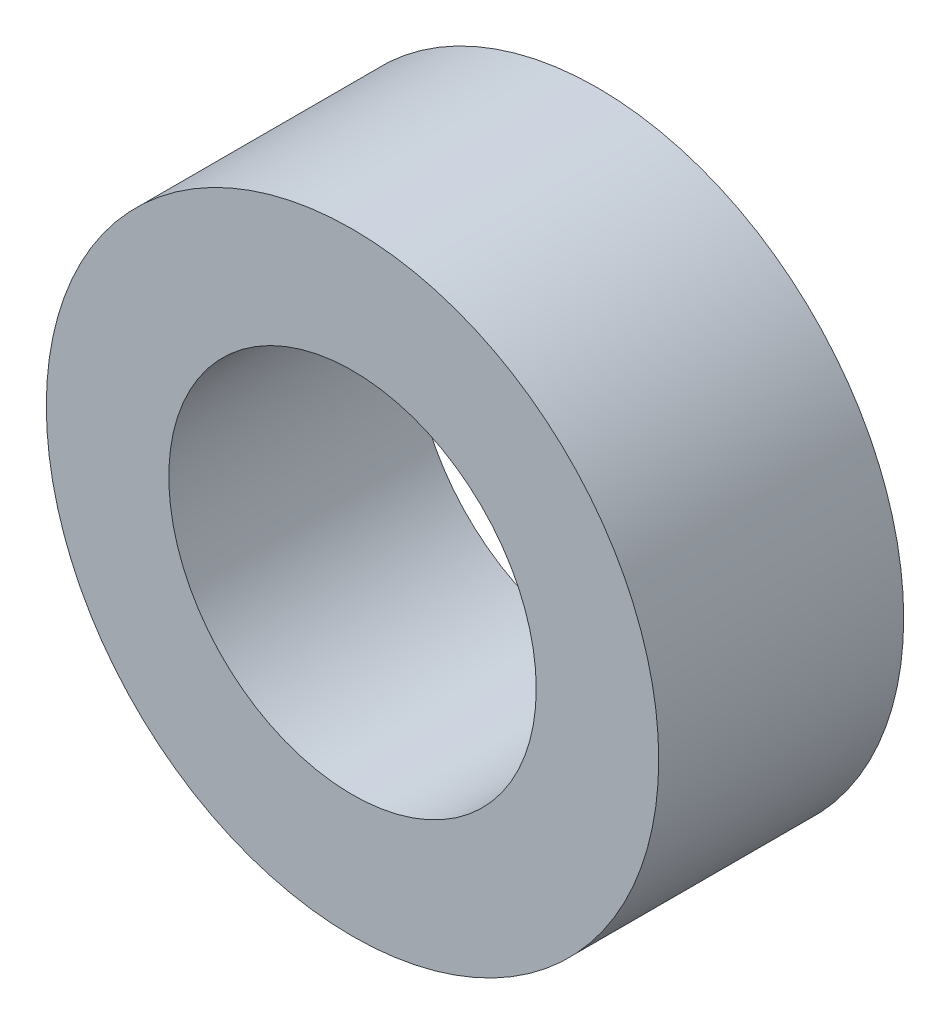
ISO-10303-21;
HEADER;
FILE_DESCRIPTION(('STEP AP214'),'2;1');
FILE_NAME('part.step','',(''),(''),'','','');
FILE_SCHEMA(('AUTOMOTIVE_DESIGN { 1 0 10303 214 1 1 1 1 }'));
ENDSEC;
DATA;
#1=APPLICATION_CONTEXT('core data for automotive mechanical design processes');
#2=APPLICATION_PROTOCOL_DEFINITION('international standard','automotive_design',2000,#1);
#3=PRODUCT_CONTEXT('',#1,'mechanical');
#4=PRODUCT('Part','Part','',(#3));
#5=PRODUCT_RELATED_PRODUCT_CATEGORY('part','',(#4));
#6=PRODUCT_DEFINITION_FORMATION('','',#4);
#7=PRODUCT_DEFINITION_CONTEXT('part definition',#1,'design');
#8=PRODUCT_DEFINITION('design','',#6,#7);
#9=PRODUCT_DEFINITION_SHAPE('','',#8);
#10=(LENGTH_UNIT() NAMED_UNIT(*) SI_UNIT(.MILLI.,.METRE.));
#11=(NAMED_UNIT(*) PLANE_ANGLE_UNIT() SI_UNIT($,.RADIAN.));
#12=(NAMED_UNIT(*) SI_UNIT($,.STERADIAN.) SOLID_ANGLE_UNIT());
#13=UNCERTAINTY_MEASURE_WITH_UNIT(LENGTH_MEASURE(1.E-05),#10,'distance_accuracy_value','');
#14=(GEOMETRIC_REPRESENTATION_CONTEXT(3) GLOBAL_UNCERTAINTY_ASSIGNED_CONTEXT((#13)) GLOBAL_UNIT_ASSIGNED_CONTEXT((#10,
#11,#12)) REPRESENTATION_CONTEXT('',''));
#15=CARTESIAN_POINT('',(0.,0.,0.));
#16=DIRECTION('',(0.,0.,1.));
#17=DIRECTION('',(1.,0.,0.));
#18=AXIS2_PLACEMENT_3D('',#15,#16,#17);
#19=CARTESIAN_POINT('',(0.,0.,6.));
#20=DIRECTION('',(0.,0.,1.));
#21=DIRECTION('',(1.,0.,0.));
#22=AXIS2_PLACEMENT_3D('',#19,#20,#21);
#23=PLANE('',#22);
#24=CARTESIAN_POINT('',(0.,0.,6.));
#25=DIRECTION('',(0.,0.,1.));
#26=DIRECTION('',(1.,0.,0.));
#27=AXIS2_PLACEMENT_3D('',#24,#25,#26);
#28=CIRCLE('',#27,7.5);
#29=CARTESIAN_POINT('',(7.5,0.,6.));
#30=VERTEX_POINT('',#29);
#31=EDGE_CURVE('E10',#30,#30,#28,.T.);
#32=ORIENTED_EDGE('',*,*,#31,.T.);
#33=EDGE_LOOP('',(#32));
#34=FACE_BOUND('',#33,.T.);
#35=CARTESIAN_POINT('',(0.,0.,6.));
#36=DIRECTION('',(0.,0.,1.));
#37=DIRECTION('',(1.,0.,0.));
#38=AXIS2_PLACEMENT_3D('',#35,#36,#37);
#39=CIRCLE('',#38,4.5);
#40=CARTESIAN_POINT('',(4.5,0.,6.));
#41=VERTEX_POINT('',#40);
#42=EDGE_CURVE('E43',#41,#41,#39,.T.);
#43=ORIENTED_EDGE('',*,*,#42,.F.);
#44=EDGE_LOOP('',(#43));
#45=FACE_BOUND('',#44,.T.);
#46=ADVANCED_FACE('F32',(#34,#45),#23,.T.);
#47=CARTESIAN_POINT('',(0.,0.,0.));
#48=DIRECTION('',(0.,0.,1.));
#49=DIRECTION('',(1.,0.,0.));
#50=AXIS2_PLACEMENT_3D('',#47,#48,#49);
#51=PLANE('',#50);
#52=CARTESIAN_POINT('',(0.,0.,0.));
#53=DIRECTION('',(0.,0.,1.));
#54=DIRECTION('',(1.,0.,0.));
#55=AXIS2_PLACEMENT_3D('',#52,#53,#54);
#56=CIRCLE('',#55,7.5);
#57=CARTESIAN_POINT('',(7.5,0.,0.));
#58=VERTEX_POINT('',#57);
#59=EDGE_CURVE('E36',#58,#58,#56,.T.);
#60=ORIENTED_EDGE('',*,*,#59,.F.);
#61=EDGE_LOOP('',(#60));
#62=FACE_BOUND('',#61,.T.);
#63=CARTESIAN_POINT('',(0.,0.,0.));
#64=DIRECTION('',(0.,0.,1.));
#65=DIRECTION('',(1.,0.,0.));
#66=AXIS2_PLACEMENT_3D('',#63,#64,#65);
#67=CIRCLE('',#66,4.5);
#68=CARTESIAN_POINT('',(4.5,0.,0.));
#69=VERTEX_POINT('',#68);
#70=EDGE_CURVE('E45',#69,#69,#67,.T.);
#71=ORIENTED_EDGE('',*,*,#70,.T.);
#72=EDGE_LOOP('',(#71));
#73=FACE_BOUND('',#72,.T.);
#74=ADVANCED_FACE('F55',(#62,#73),#51,.F.);
#75=CARTESIAN_POINT('',(0.,0.,6.));
#76=DIRECTION('',(0.,0.,-1.));
#77=DIRECTION('',(-1.,0.,0.));
#78=AXIS2_PLACEMENT_3D('',#75,#76,#77);
#79=CYLINDRICAL_SURFACE('',#78,7.5);
#80=ORIENTED_EDGE('',*,*,#31,.F.);
#81=EDGE_LOOP('',(#80));
#82=FACE_BOUND('',#81,.T.);
#83=ORIENTED_EDGE('',*,*,#59,.T.);
#84=EDGE_LOOP('',(#83));
#85=FACE_BOUND('',#84,.T.);
#86=ADVANCED_FACE('F34',(#82,#85),#79,.T.);
#87=CARTESIAN_POINT('',(0.,0.,6.));
#88=DIRECTION('',(0.,0.,-1.));
#89=DIRECTION('',(-1.,0.,0.));
#90=AXIS2_PLACEMENT_3D('',#87,#88,#89);
#91=CYLINDRICAL_SURFACE('',#90,4.5);
#92=ORIENTED_EDGE('',*,*,#42,.T.);
#93=EDGE_LOOP('',(#92));
#94=FACE_BOUND('',#93,.T.);
#95=ORIENTED_EDGE('',*,*,#70,.F.);
#96=EDGE_LOOP('',(#95));
#97=FACE_BOUND('',#96,.T.);
#98=ADVANCED_FACE('F51',(#94,#97),#91,.F.);
#99=CLOSED_SHELL('',(#46,#74,#86,#98));
#100=MANIFOLD_SOLID_BREP('B2',#99);
#101=ADVANCED_BREP_SHAPE_REPRESENTATION('',(#18,#100),#14);
#102=SHAPE_DEFINITION_REPRESENTATION(#9,#101);
ENDSEC;
END-ISO-10303-21;
